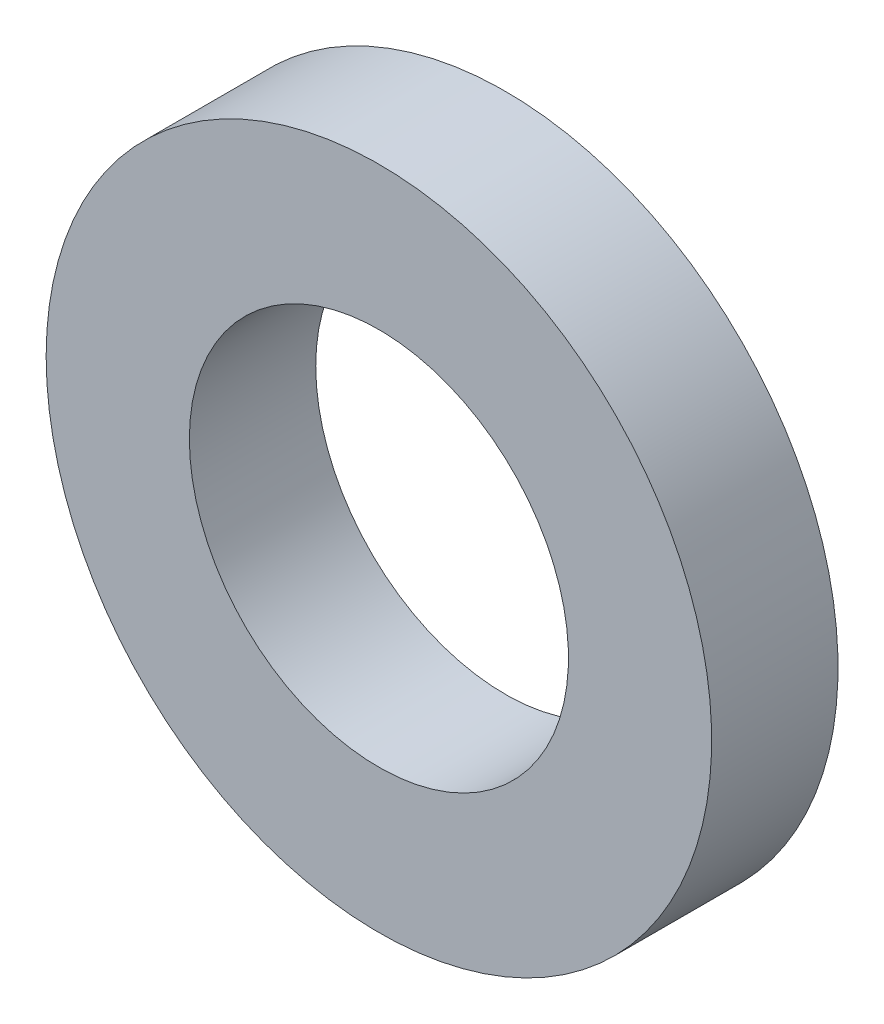
ISO-10303-21;
HEADER;
FILE_DESCRIPTION(('STEP AP214'),'2;1');
FILE_NAME('part.step','',(''),(''),'','','');
FILE_SCHEMA(('AUTOMOTIVE_DESIGN { 1 0 10303 214 1 1 1 1 }'));
ENDSEC;
DATA;
#1=APPLICATION_CONTEXT('core data for automotive mechanical design processes');
#2=APPLICATION_PROTOCOL_DEFINITION('international standard','automotive_design',2000,#1);
#3=PRODUCT_CONTEXT('',#1,'mechanical');
#4=PRODUCT('Part','Part','',(#3));
#5=PRODUCT_RELATED_PRODUCT_CATEGORY('part','',(#4));
#6=PRODUCT_DEFINITION_FORMATION('','',#4);
#7=PRODUCT_DEFINITION_CONTEXT('part definition',#1,'design');
#8=PRODUCT_DEFINITION('design','',#6,#7);
#9=PRODUCT_DEFINITION_SHAPE('','',#8);
#10=(LENGTH_UNIT() NAMED_UNIT(*) SI_UNIT(.MILLI.,.METRE.));
#11=(NAMED_UNIT(*) PLANE_ANGLE_UNIT() SI_UNIT($,.RADIAN.));
#12=(NAMED_UNIT(*) SI_UNIT($,.STERADIAN.) SOLID_ANGLE_UNIT());
#13=UNCERTAINTY_MEASURE_WITH_UNIT(LENGTH_MEASURE(1.E-05),#10,'distance_accuracy_value','');
#14=(GEOMETRIC_REPRESENTATION_CONTEXT(3) GLOBAL_UNCERTAINTY_ASSIGNED_CONTEXT((#13)) GLOBAL_UNIT_ASSIGNED_CONTEXT((#10,
#11,#12)) REPRESENTATION_CONTEXT('',''));
#15=CARTESIAN_POINT('',(0.,0.,0.));
#16=DIRECTION('',(0.,0.,1.));
#17=DIRECTION('',(1.,0.,0.));
#18=AXIS2_PLACEMENT_3D('',#15,#16,#17);
#19=CARTESIAN_POINT('',(0.,0.,25.3445742854949));
#20=DIRECTION('',(0.,0.,-1.));
#21=DIRECTION('',(-1.,0.,0.));
#22=AXIS2_PLACEMENT_3D('',#19,#20,#21);
#23=CYLINDRICAL_SURFACE('',#22,7.9);
#24=CARTESIAN_POINT('',(0.,0.,0.));
#25=DIRECTION('',(0.,0.,1.));
#26=DIRECTION('',(1.,0.,0.));
#27=AXIS2_PLACEMENT_3D('',#24,#25,#26);
#28=CIRCLE('',#27,7.9);
#29=CARTESIAN_POINT('',(-7.9,0.,0.));
#30=VERTEX_POINT('',#29);
#31=EDGE_CURVE('E40',#30,#30,#28,.T.);
#32=CARTESIAN_POINT('',(0.,0.,3.));
#33=DIRECTION('',(0.,0.,1.));
#34=DIRECTION('',(1.,0.,0.));
#35=AXIS2_PLACEMENT_3D('',#32,#33,#34);
#36=CIRCLE('',#35,7.9);
#37=CARTESIAN_POINT('',(-7.9,0.,3.));
#38=VERTEX_POINT('',#37);
#39=EDGE_CURVE('E10',#38,#38,#36,.T.);
#40=CARTESIAN_POINT('',(-7.9,0.,0.));
#41=CARTESIAN_POINT('',(-7.9,0.,0.03125));
#42=CARTESIAN_POINT('',(-7.9,0.,0.0625000000000001));
#43=CARTESIAN_POINT('',(-7.9,0.,0.125));
#44=CARTESIAN_POINT('',(-7.9,0.,0.15625));
#45=CARTESIAN_POINT('',(-7.9,0.,0.21875));
#46=CARTESIAN_POINT('',(-7.9,0.,0.25));
#47=CARTESIAN_POINT('',(-7.9,0.,0.3125));
#48=CARTESIAN_POINT('',(-7.9,0.,0.34375));
#49=CARTESIAN_POINT('',(-7.9,0.,0.40625));
#50=CARTESIAN_POINT('',(-7.9,0.,0.4375));
#51=CARTESIAN_POINT('',(-7.9,0.,0.5));
#52=CARTESIAN_POINT('',(-7.9,0.,0.53125));
#53=CARTESIAN_POINT('',(-7.9,0.,0.593750000000001));
#54=CARTESIAN_POINT('',(-7.9,0.,0.625000000000001));
#55=CARTESIAN_POINT('',(-7.9,0.,0.687500000000001));
#56=CARTESIAN_POINT('',(-7.9,0.,0.718750000000001));
#57=CARTESIAN_POINT('',(-7.9,0.,0.78125));
#58=CARTESIAN_POINT('',(-7.9,0.,0.812499999999998));
#59=CARTESIAN_POINT('',(-7.9,0.,0.874999999999997));
#60=CARTESIAN_POINT('',(-7.9,0.,0.906249999999997));
#61=CARTESIAN_POINT('',(-7.9,0.,0.968749999999997));
#62=CARTESIAN_POINT('',(-7.9,0.,0.999999999999997));
#63=CARTESIAN_POINT('',(-7.9,0.,1.0625));
#64=CARTESIAN_POINT('',(-7.9,0.,1.09375));
#65=CARTESIAN_POINT('',(-7.9,0.,1.15625));
#66=CARTESIAN_POINT('',(-7.9,0.,1.1875));
#67=CARTESIAN_POINT('',(-7.9,0.,1.25));
#68=CARTESIAN_POINT('',(-7.9,0.,1.28125));
#69=CARTESIAN_POINT('',(-7.9,0.,1.34375));
#70=CARTESIAN_POINT('',(-7.9,0.,1.375));
#71=CARTESIAN_POINT('',(-7.9,0.,1.4375));
#72=CARTESIAN_POINT('',(-7.9,0.,1.46875));
#73=CARTESIAN_POINT('',(-7.9,0.,1.53125));
#74=CARTESIAN_POINT('',(-7.9,0.,1.5625));
#75=CARTESIAN_POINT('',(-7.9,0.,1.625));
#76=CARTESIAN_POINT('',(-7.9,0.,1.65625));
#77=CARTESIAN_POINT('',(-7.9,0.,1.71875));
#78=CARTESIAN_POINT('',(-7.9,0.,1.75));
#79=CARTESIAN_POINT('',(-7.9,0.,1.8125));
#80=CARTESIAN_POINT('',(-7.9,0.,1.84375));
#81=CARTESIAN_POINT('',(-7.9,0.,1.90625));
#82=CARTESIAN_POINT('',(-7.9,0.,1.9375));
#83=CARTESIAN_POINT('',(-7.9,0.,2.));
#84=CARTESIAN_POINT('',(-7.9,0.,2.03125));
#85=CARTESIAN_POINT('',(-7.9,0.,2.09375));
#86=CARTESIAN_POINT('',(-7.9,0.,2.125));
#87=CARTESIAN_POINT('',(-7.9,0.,2.1875));
#88=CARTESIAN_POINT('',(-7.9,0.,2.21875));
#89=CARTESIAN_POINT('',(-7.9,0.,2.28125));
#90=CARTESIAN_POINT('',(-7.9,0.,2.3125));
#91=CARTESIAN_POINT('',(-7.9,0.,2.375));
#92=CARTESIAN_POINT('',(-7.9,0.,2.40625));
#93=CARTESIAN_POINT('',(-7.9,0.,2.46875));
#94=CARTESIAN_POINT('',(-7.9,0.,2.5));
#95=CARTESIAN_POINT('',(-7.9,0.,2.5625));
#96=CARTESIAN_POINT('',(-7.9,0.,2.59375));
#97=CARTESIAN_POINT('',(-7.9,0.,2.65625));
#98=CARTESIAN_POINT('',(-7.9,0.,2.6875));
#99=CARTESIAN_POINT('',(-7.9,0.,2.75));
#100=CARTESIAN_POINT('',(-7.9,0.,2.78125));
#101=CARTESIAN_POINT('',(-7.9,0.,2.84375));
#102=CARTESIAN_POINT('',(-7.9,0.,2.875));
#103=CARTESIAN_POINT('',(-7.9,0.,2.9375));
#104=CARTESIAN_POINT('',(-7.9,0.,2.96875));
#105=CARTESIAN_POINT('',(-7.9,0.,3.));
#106=B_SPLINE_CURVE_WITH_KNOTS('',3,(#40,#41,#42,#43,#44,#45,#46,#47,#48,#49,#50,#51,#52,#53,
#54,#55,#56,#57,#58,#59,#60,#61,#62,#63,#64,#65,#66,#67,#68,#69,#70,#71,#72,#73,#74,#75,#76,#77,
#78,#79,#80,#81,#82,#83,#84,#85,#86,#87,#88,#89,#90,#91,#92,#93,#94,#95,#96,#97,#98,#99,#100,
#101,#102,#103,#104,#105),.UNSPECIFIED.,.F.,.F.,(4,2,2,2,2,2,2,2,2,2,2,2,2,2,2,2,2,2,2,2,2,2,2,
2,2,2,2,2,2,2,2,2,4),(0.,0.0937500000000001,0.1875,0.28125,0.375,0.46875,0.5625,
0.656250000000001,0.750000000000001,0.843749999999997,0.937499999999997,1.03125,1.125,1.21875,
1.3125,1.40625,1.5,1.59375,1.6875,1.78125,1.875,1.96875,2.0625,2.15625,2.25,2.34375,2.4375,
2.53125,2.625,2.71875,2.8125,2.90625,3.),.UNSPECIFIED.);
#107=EDGE_CURVE('BSEAM33',#30,#38,#106,.T.);
#108=ORIENTED_EDGE('',*,*,#31,.T.);
#109=ORIENTED_EDGE('',*,*,#39,.F.);
#110=ORIENTED_EDGE('',*,*,#107,.T.);
#111=ORIENTED_EDGE('',*,*,#107,.F.);
#112=EDGE_LOOP('',(#108,#110,#109,#111));
#113=FACE_BOUND('',#112,.T.);
#114=ADVANCED_FACE('F33',(#113),#23,.T.);
#115=CARTESIAN_POINT('',(0.,0.,0.));
#116=DIRECTION('',(0.,0.,1.));
#117=DIRECTION('',(1.,0.,0.));
#118=AXIS2_PLACEMENT_3D('',#115,#116,#117);
#119=PLANE('',#118);
#120=ORIENTED_EDGE('',*,*,#31,.F.);
#121=EDGE_LOOP('',(#120));
#122=FACE_BOUND('',#121,.T.);
#123=CARTESIAN_POINT('',(0.,0.,0.));
#124=DIRECTION('',(0.,0.,1.));
#125=DIRECTION('',(1.,0.,0.));
#126=AXIS2_PLACEMENT_3D('',#123,#124,#125);
#127=CIRCLE('',#126,4.5);
#128=CARTESIAN_POINT('',(-4.5,0.,0.));
#129=VERTEX_POINT('',#128);
#130=EDGE_CURVE('E45',#129,#129,#127,.T.);
#131=ORIENTED_EDGE('',*,*,#130,.T.);
#132=EDGE_LOOP('',(#131));
#133=FACE_BOUND('',#132,.T.);
#134=ADVANCED_FACE('F61',(#122,#133),#119,.F.);
#135=CARTESIAN_POINT('',(0.,0.,25.3445742854949));
#136=DIRECTION('',(0.,0.,-1.));
#137=DIRECTION('',(-1.,0.,0.));
#138=AXIS2_PLACEMENT_3D('',#135,#136,#137);
#139=CYLINDRICAL_SURFACE('',#138,4.5);
#140=CARTESIAN_POINT('',(0.,0.,3.));
#141=DIRECTION('',(0.,0.,1.));
#142=DIRECTION('',(1.,0.,0.));
#143=AXIS2_PLACEMENT_3D('',#140,#141,#142);
#144=CIRCLE('',#143,4.5);
#145=CARTESIAN_POINT('',(-4.5,0.,3.));
#146=VERTEX_POINT('',#145);
#147=EDGE_CURVE('E36',#146,#146,#144,.T.);
#148=CARTESIAN_POINT('',(-4.5,0.,0.));
#149=CARTESIAN_POINT('',(-4.5,0.,0.03125));
#150=CARTESIAN_POINT('',(-4.5,0.,0.0625000000000001));
#151=CARTESIAN_POINT('',(-4.5,0.,0.125));
#152=CARTESIAN_POINT('',(-4.5,0.,0.15625));
#153=CARTESIAN_POINT('',(-4.5,0.,0.21875));
#154=CARTESIAN_POINT('',(-4.5,0.,0.25));
#155=CARTESIAN_POINT('',(-4.5,0.,0.3125));
#156=CARTESIAN_POINT('',(-4.5,0.,0.34375));
#157=CARTESIAN_POINT('',(-4.5,0.,0.40625));
#158=CARTESIAN_POINT('',(-4.5,0.,0.4375));
#159=CARTESIAN_POINT('',(-4.5,0.,0.5));
#160=CARTESIAN_POINT('',(-4.5,0.,0.53125));
#161=CARTESIAN_POINT('',(-4.5,0.,0.593750000000001));
#162=CARTESIAN_POINT('',(-4.5,0.,0.625000000000001));
#163=CARTESIAN_POINT('',(-4.5,0.,0.687500000000001));
#164=CARTESIAN_POINT('',(-4.5,0.,0.718750000000001));
#165=CARTESIAN_POINT('',(-4.5,0.,0.78125));
#166=CARTESIAN_POINT('',(-4.5,0.,0.812499999999998));
#167=CARTESIAN_POINT('',(-4.5,0.,0.874999999999997));
#168=CARTESIAN_POINT('',(-4.5,0.,0.906249999999997));
#169=CARTESIAN_POINT('',(-4.5,0.,0.968749999999997));
#170=CARTESIAN_POINT('',(-4.5,0.,0.999999999999997));
#171=CARTESIAN_POINT('',(-4.5,0.,1.0625));
#172=CARTESIAN_POINT('',(-4.5,0.,1.09375));
#173=CARTESIAN_POINT('',(-4.5,0.,1.15625));
#174=CARTESIAN_POINT('',(-4.5,0.,1.1875));
#175=CARTESIAN_POINT('',(-4.5,0.,1.25));
#176=CARTESIAN_POINT('',(-4.5,0.,1.28125));
#177=CARTESIAN_POINT('',(-4.5,0.,1.34375));
#178=CARTESIAN_POINT('',(-4.5,0.,1.375));
#179=CARTESIAN_POINT('',(-4.5,0.,1.4375));
#180=CARTESIAN_POINT('',(-4.5,0.,1.46875));
#181=CARTESIAN_POINT('',(-4.5,0.,1.53125));
#182=CARTESIAN_POINT('',(-4.5,0.,1.5625));
#183=CARTESIAN_POINT('',(-4.5,0.,1.625));
#184=CARTESIAN_POINT('',(-4.5,0.,1.65625));
#185=CARTESIAN_POINT('',(-4.5,0.,1.71875));
#186=CARTESIAN_POINT('',(-4.5,0.,1.75));
#187=CARTESIAN_POINT('',(-4.5,0.,1.8125));
#188=CARTESIAN_POINT('',(-4.5,0.,1.84375));
#189=CARTESIAN_POINT('',(-4.5,0.,1.90625));
#190=CARTESIAN_POINT('',(-4.5,0.,1.9375));
#191=CARTESIAN_POINT('',(-4.5,0.,2.));
#192=CARTESIAN_POINT('',(-4.5,0.,2.03125));
#193=CARTESIAN_POINT('',(-4.5,0.,2.09375));
#194=CARTESIAN_POINT('',(-4.5,0.,2.125));
#195=CARTESIAN_POINT('',(-4.5,0.,2.1875));
#196=CARTESIAN_POINT('',(-4.5,0.,2.21875));
#197=CARTESIAN_POINT('',(-4.5,0.,2.28125));
#198=CARTESIAN_POINT('',(-4.5,0.,2.3125));
#199=CARTESIAN_POINT('',(-4.5,0.,2.375));
#200=CARTESIAN_POINT('',(-4.5,0.,2.40625));
#201=CARTESIAN_POINT('',(-4.5,0.,2.46875));
#202=CARTESIAN_POINT('',(-4.5,0.,2.5));
#203=CARTESIAN_POINT('',(-4.5,0.,2.5625));
#204=CARTESIAN_POINT('',(-4.5,0.,2.59375));
#205=CARTESIAN_POINT('',(-4.5,0.,2.65625));
#206=CARTESIAN_POINT('',(-4.5,0.,2.6875));
#207=CARTESIAN_POINT('',(-4.5,0.,2.75));
#208=CARTESIAN_POINT('',(-4.5,0.,2.78125));
#209=CARTESIAN_POINT('',(-4.5,0.,2.84375));
#210=CARTESIAN_POINT('',(-4.5,0.,2.875));
#211=CARTESIAN_POINT('',(-4.5,0.,2.9375));
#212=CARTESIAN_POINT('',(-4.5,0.,2.96875));
#213=CARTESIAN_POINT('',(-4.5,0.,3.));
#214=B_SPLINE_CURVE_WITH_KNOTS('',3,(#148,#149,#150,#151,#152,#153,#154,#155,#156,#157,#158,
#159,#160,#161,#162,#163,#164,#165,#166,#167,#168,#169,#170,#171,#172,#173,#174,#175,#176,#177,
#178,#179,#180,#181,#182,#183,#184,#185,#186,#187,#188,#189,#190,#191,#192,#193,#194,#195,#196,
#197,#198,#199,#200,#201,#202,#203,#204,#205,#206,#207,#208,#209,#210,#211,#212,#213),
.UNSPECIFIED.,.F.,.F.,(4,2,2,2,2,2,2,2,2,2,2,2,2,2,2,2,2,2,2,2,2,2,2,2,2,2,2,2,2,2,2,2,4),(0.,
0.0937500000000001,0.1875,0.28125,0.375,0.46875,0.5625,0.656250000000001,0.750000000000001,
0.843749999999997,0.937499999999997,1.03125,1.125,1.21875,1.3125,1.40625,1.5,1.59375,1.6875,
1.78125,1.875,1.96875,2.0625,2.15625,2.25,2.34375,2.4375,2.53125,2.625,2.71875,2.8125,2.90625,
3.),.UNSPECIFIED.);
#215=EDGE_CURVE('BSEAM53',#129,#146,#214,.T.);
#216=ORIENTED_EDGE('',*,*,#130,.F.);
#217=ORIENTED_EDGE('',*,*,#147,.T.);
#218=ORIENTED_EDGE('',*,*,#215,.T.);
#219=ORIENTED_EDGE('',*,*,#215,.F.);
#220=EDGE_LOOP('',(#216,#218,#217,#219));
#221=FACE_BOUND('',#220,.T.);
#222=ADVANCED_FACE('F53',(#221),#139,.F.);
#223=CARTESIAN_POINT('',(0.,0.,3.));
#224=DIRECTION('',(0.,0.,1.));
#225=DIRECTION('',(1.,0.,0.));
#226=AXIS2_PLACEMENT_3D('',#223,#224,#225);
#227=PLANE('',#226);
#228=ORIENTED_EDGE('',*,*,#147,.F.);
#229=EDGE_LOOP('',(#228));
#230=FACE_BOUND('',#229,.T.);
#231=ORIENTED_EDGE('',*,*,#39,.T.);
#232=EDGE_LOOP('',(#231));
#233=FACE_BOUND('',#232,.T.);
#234=ADVANCED_FACE('F55',(#230,#233),#227,.T.);
#235=CLOSED_SHELL('',(#114,#134,#222,#234));
#236=MANIFOLD_SOLID_BREP('B2',#235);
#237=ADVANCED_BREP_SHAPE_REPRESENTATION('',(#18,#236),#14);
#238=SHAPE_DEFINITION_REPRESENTATION(#9,#237);
ENDSEC;
END-ISO-10303-21;
